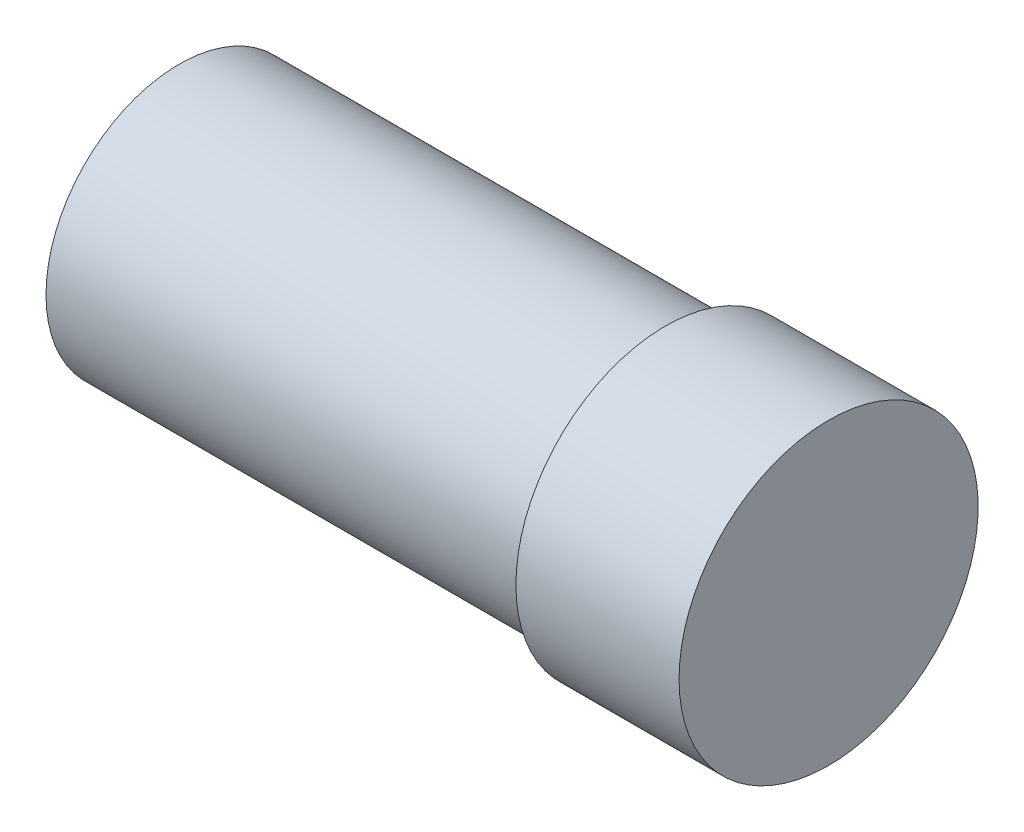
ISO-10303-21;
HEADER;
FILE_DESCRIPTION(('STEP AP214'),'2;1');
FILE_NAME('part.step','',(''),(''),'','','');
FILE_SCHEMA(('AUTOMOTIVE_DESIGN { 1 0 10303 214 1 1 1 1 }'));
ENDSEC;
DATA;
#1=APPLICATION_CONTEXT('core data for automotive mechanical design processes');
#2=APPLICATION_PROTOCOL_DEFINITION('international standard','automotive_design',2000,#1);
#3=PRODUCT_CONTEXT('',#1,'mechanical');
#4=PRODUCT('Part','Part','',(#3));
#5=PRODUCT_RELATED_PRODUCT_CATEGORY('part','',(#4));
#6=PRODUCT_DEFINITION_FORMATION('','',#4);
#7=PRODUCT_DEFINITION_CONTEXT('part definition',#1,'design');
#8=PRODUCT_DEFINITION('design','',#6,#7);
#9=PRODUCT_DEFINITION_SHAPE('','',#8);
#10=(LENGTH_UNIT() NAMED_UNIT(*) SI_UNIT(.MILLI.,.METRE.));
#11=(NAMED_UNIT(*) PLANE_ANGLE_UNIT() SI_UNIT($,.RADIAN.));
#12=(NAMED_UNIT(*) SI_UNIT($,.STERADIAN.) SOLID_ANGLE_UNIT());
#13=UNCERTAINTY_MEASURE_WITH_UNIT(LENGTH_MEASURE(1.E-05),#10,'distance_accuracy_value','');
#14=(GEOMETRIC_REPRESENTATION_CONTEXT(3) GLOBAL_UNCERTAINTY_ASSIGNED_CONTEXT((#13)) GLOBAL_UNIT_ASSIGNED_CONTEXT((#10,
#11,#12)) REPRESENTATION_CONTEXT('',''));
#15=CARTESIAN_POINT('',(0.,0.,0.));
#16=DIRECTION('',(0.,0.,1.));
#17=DIRECTION('',(1.,0.,0.));
#18=AXIS2_PLACEMENT_3D('',#15,#16,#17);
#19=CARTESIAN_POINT('',(-22.3499999999997,0.,0.));
#20=DIRECTION('',(1.,0.,0.));
#21=DIRECTION('',(0.,0.,-1.));
#22=AXIS2_PLACEMENT_3D('',#19,#20,#21);
#23=PLANE('',#22);
#24=CARTESIAN_POINT('',(-22.3499999999997,0.,0.));
#25=DIRECTION('',(-1.,0.,0.));
#26=DIRECTION('',(0.,0.,1.));
#27=AXIS2_PLACEMENT_3D('',#24,#25,#26);
#28=CIRCLE('',#27,12.25);
#29=CARTESIAN_POINT('',(-22.3499999999997,0.,12.25));
#30=VERTEX_POINT('',#29);
#31=EDGE_CURVE('E65',#30,#30,#28,.T.);
#32=ORIENTED_EDGE('',*,*,#31,.T.);
#33=EDGE_LOOP('',(#32));
#34=FACE_BOUND('',#33,.T.);
#35=ADVANCED_FACE('F44',(#34),#23,.F.);
#36=CARTESIAN_POINT('',(37.35,0.,0.));
#37=DIRECTION('',(1.,0.,0.));
#38=DIRECTION('',(0.,0.,-1.));
#39=AXIS2_PLACEMENT_3D('',#36,#37,#38);
#40=PLANE('',#39);
#41=CARTESIAN_POINT('',(37.35,0.,0.));
#42=DIRECTION('',(-1.,0.,0.));
#43=DIRECTION('',(0.,0.,1.));
#44=AXIS2_PLACEMENT_3D('',#41,#42,#43);
#45=CIRCLE('',#44,13.75);
#46=CARTESIAN_POINT('',(37.35,0.,13.75));
#47=VERTEX_POINT('',#46);
#48=EDGE_CURVE('E10',#47,#47,#45,.T.);
#49=ORIENTED_EDGE('',*,*,#48,.F.);
#50=EDGE_LOOP('',(#49));
#51=FACE_BOUND('',#50,.T.);
#52=ADVANCED_FACE('F85',(#51),#40,.T.);
#53=CARTESIAN_POINT('',(-22.35,0.,0.));
#54=DIRECTION('',(-1.,0.,0.));
#55=DIRECTION('',(0.,0.,1.));
#56=AXIS2_PLACEMENT_3D('',#53,#54,#55);
#57=CYLINDRICAL_SURFACE('',#56,13.75);
#58=ORIENTED_EDGE('',*,*,#48,.T.);
#59=EDGE_LOOP('',(#58));
#60=FACE_BOUND('',#59,.T.);
#61=CARTESIAN_POINT('',(22.35,0.,0.));
#62=DIRECTION('',(-1.,0.,0.));
#63=DIRECTION('',(0.,0.,1.));
#64=AXIS2_PLACEMENT_3D('',#61,#62,#63);
#65=CIRCLE('',#64,13.7500000000001);
#66=CARTESIAN_POINT('',(22.35,0.,13.7500000000001));
#67=VERTEX_POINT('',#66);
#68=EDGE_CURVE('E55',#67,#67,#65,.T.);
#69=ORIENTED_EDGE('',*,*,#68,.F.);
#70=EDGE_LOOP('',(#69));
#71=FACE_BOUND('',#70,.T.);
#72=ADVANCED_FACE('F79',(#60,#71),#57,.T.);
#73=CARTESIAN_POINT('',(22.3499999999999,-4.49744408381658E-12,0.));
#74=DIRECTION('',(1.,0.,0.));
#75=DIRECTION('',(0.,0.,-1.));
#76=AXIS2_PLACEMENT_3D('',#73,#74,#75);
#77=PLANE('',#76);
#78=CARTESIAN_POINT('',(22.3499999999997,0.,0.));
#79=DIRECTION('',(-1.,0.,0.));
#80=DIRECTION('',(0.,0.,1.));
#81=AXIS2_PLACEMENT_3D('',#78,#79,#80);
#82=CIRCLE('',#81,12.25);
#83=CARTESIAN_POINT('',(22.3499999999997,0.,12.25));
#84=VERTEX_POINT('',#83);
#85=EDGE_CURVE('E60',#84,#84,#82,.T.);
#86=ORIENTED_EDGE('',*,*,#85,.F.);
#87=EDGE_LOOP('',(#86));
#88=FACE_BOUND('',#87,.T.);
#89=ORIENTED_EDGE('',*,*,#68,.T.);
#90=EDGE_LOOP('',(#89));
#91=FACE_BOUND('',#90,.T.);
#92=ADVANCED_FACE('F75',(#88,#91),#77,.F.);
#93=CARTESIAN_POINT('',(-22.35,0.,0.));
#94=DIRECTION('',(-1.,0.,0.));
#95=DIRECTION('',(0.,0.,1.));
#96=AXIS2_PLACEMENT_3D('',#93,#94,#95);
#97=CYLINDRICAL_SURFACE('',#96,12.25);
#98=ORIENTED_EDGE('',*,*,#85,.T.);
#99=EDGE_LOOP('',(#98));
#100=FACE_BOUND('',#99,.T.);
#101=ORIENTED_EDGE('',*,*,#31,.F.);
#102=EDGE_LOOP('',(#101));
#103=FACE_BOUND('',#102,.T.);
#104=ADVANCED_FACE('F69',(#100,#103),#97,.T.);
#105=CLOSED_SHELL('',(#35,#52,#72,#92,#104));
#106=MANIFOLD_SOLID_BREP('B2',#105);
#107=ADVANCED_BREP_SHAPE_REPRESENTATION('',(#18,#106),#14);
#108=SHAPE_DEFINITION_REPRESENTATION(#9,#107);
ENDSEC;
END-ISO-10303-21;
